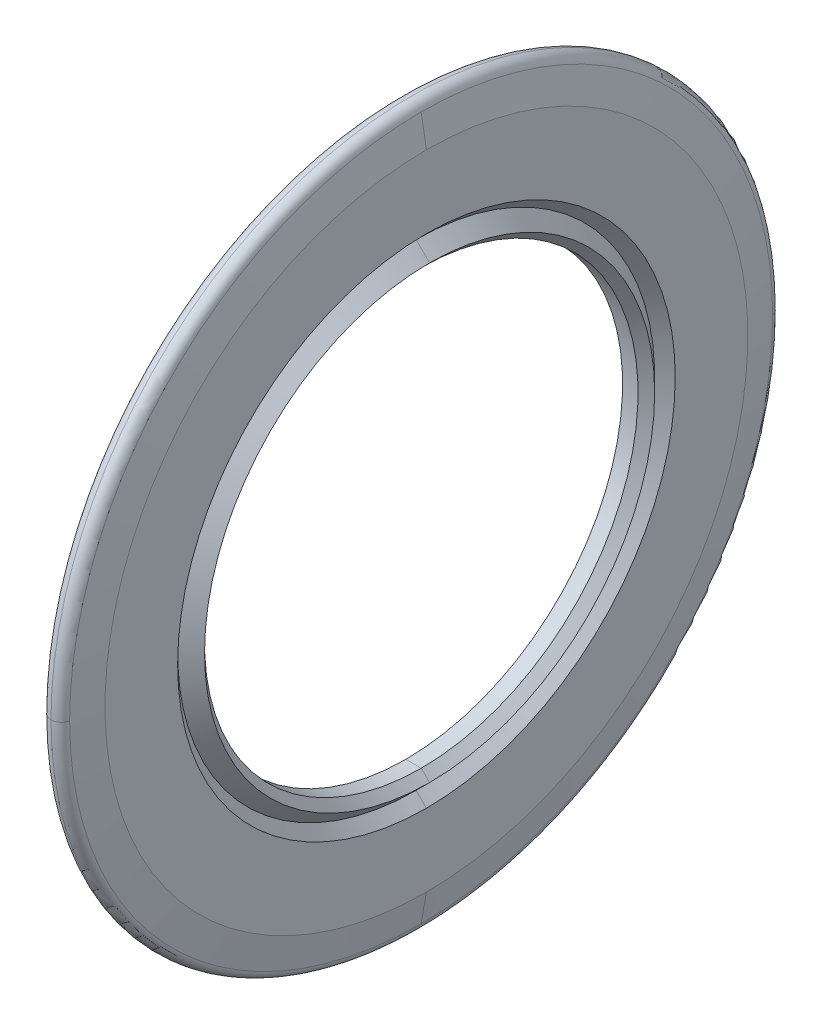
ISO-10303-21;
HEADER;
FILE_DESCRIPTION(('STEP AP214'),'2;1');
FILE_NAME('part.step','',(''),(''),'','','');
FILE_SCHEMA(('AUTOMOTIVE_DESIGN { 1 0 10303 214 1 1 1 1 }'));
ENDSEC;
DATA;
#1=APPLICATION_CONTEXT('core data for automotive mechanical design processes');
#2=APPLICATION_PROTOCOL_DEFINITION('international standard','automotive_design',2000,#1);
#3=PRODUCT_CONTEXT('',#1,'mechanical');
#4=PRODUCT('Part','Part','',(#3));
#5=PRODUCT_RELATED_PRODUCT_CATEGORY('part','',(#4));
#6=PRODUCT_DEFINITION_FORMATION('','',#4);
#7=PRODUCT_DEFINITION_CONTEXT('part definition',#1,'design');
#8=PRODUCT_DEFINITION('design','',#6,#7);
#9=PRODUCT_DEFINITION_SHAPE('','',#8);
#10=(LENGTH_UNIT() NAMED_UNIT(*) SI_UNIT(.MILLI.,.METRE.));
#11=(NAMED_UNIT(*) PLANE_ANGLE_UNIT() SI_UNIT($,.RADIAN.));
#12=(NAMED_UNIT(*) SI_UNIT($,.STERADIAN.) SOLID_ANGLE_UNIT());
#13=UNCERTAINTY_MEASURE_WITH_UNIT(LENGTH_MEASURE(1.E-05),#10,'distance_accuracy_value','');
#14=(GEOMETRIC_REPRESENTATION_CONTEXT(3) GLOBAL_UNCERTAINTY_ASSIGNED_CONTEXT((#13)) GLOBAL_UNIT_ASSIGNED_CONTEXT((#10,
#11,#12)) REPRESENTATION_CONTEXT('',''));
#15=CARTESIAN_POINT('',(0.,0.,0.));
#16=DIRECTION('',(0.,0.,1.));
#17=DIRECTION('',(1.,0.,0.));
#18=AXIS2_PLACEMENT_3D('',#15,#16,#17);
#19=CARTESIAN_POINT('',(0.14,9.2215,0.));
#20=DIRECTION('',(-1.,0.,0.));
#21=DIRECTION('',(0.,0.,1.));
#22=AXIS2_PLACEMENT_3D('',#19,#20,#21);
#23=PLANE('',#22);
#24=CARTESIAN_POINT('',(0.14,0.,0.));
#25=DIRECTION('',(1.,0.,0.));
#26=DIRECTION('',(0.,1.,0.));
#27=AXIS2_PLACEMENT_3D('',#24,#25,#26);
#28=CIRCLE('',#27,8.9335);
#29=CARTESIAN_POINT('',(0.14,8.9335,0.));
#30=VERTEX_POINT('',#29);
#31=CARTESIAN_POINT('',(0.14,-8.9335,0.));
#32=VERTEX_POINT('',#31);
#33=EDGE_CURVE('E11',#30,#32,#28,.T.);
#34=ORIENTED_EDGE('',*,*,#33,.T.);
#35=CARTESIAN_POINT('',(0.14,0.,0.));
#36=DIRECTION('',(1.,0.,0.));
#37=DIRECTION('',(0.,1.,0.));
#38=AXIS2_PLACEMENT_3D('',#35,#36,#37);
#39=CIRCLE('',#38,8.9335);
#40=EDGE_CURVE('E192',#32,#30,#39,.T.);
#41=ORIENTED_EDGE('',*,*,#40,.T.);
#42=EDGE_LOOP('',(#34,#41));
#43=FACE_BOUND('',#42,.T.);
#44=CARTESIAN_POINT('',(0.14,0.,0.));
#45=DIRECTION('',(1.,0.,0.));
#46=DIRECTION('',(0.,1.,0.));
#47=AXIS2_PLACEMENT_3D('',#44,#45,#46);
#48=CIRCLE('',#47,9.5095);
#49=CARTESIAN_POINT('',(0.14,0.,-9.5095));
#50=VERTEX_POINT('',#49);
#51=CARTESIAN_POINT('',(0.14,0.,9.5095));
#52=VERTEX_POINT('',#51);
#53=EDGE_CURVE('E148',#50,#52,#48,.T.);
#54=ORIENTED_EDGE('',*,*,#53,.F.);
#55=CARTESIAN_POINT('',(0.14,0.,0.));
#56=DIRECTION('',(1.,0.,0.));
#57=DIRECTION('',(0.,1.,0.));
#58=AXIS2_PLACEMENT_3D('',#55,#56,#57);
#59=CIRCLE('',#58,9.5095);
#60=EDGE_CURVE('E157',#52,#50,#59,.T.);
#61=ORIENTED_EDGE('',*,*,#60,.F.);
#62=EDGE_LOOP('',(#54,#61));
#63=FACE_BOUND('',#62,.T.);
#64=ADVANCED_FACE('F16',(#43,#63),#23,.T.);
#65=CARTESIAN_POINT('',(0.21,0.,0.));
#66=DIRECTION('',(-1.,0.,0.));
#67=DIRECTION('',(0.,1.,0.));
#68=AXIS2_PLACEMENT_3D('',#65,#66,#67);
#69=CONICAL_SURFACE('',#68,8.8635,0.785398163397444);
#70=DIRECTION('',(0.70710678118655,-0.707106781186545,0.));
#71=VECTOR('',#70,1.);
#72=CARTESIAN_POINT('',(0.21,8.8635,0.));
#73=LINE('',#72,#71);
#74=CARTESIAN_POINT('',(0.28,8.7935,0.));
#75=VERTEX_POINT('',#74);
#76=EDGE_CURVE('E169',#30,#75,#73,.T.);
#77=ORIENTED_EDGE('',*,*,#76,.T.);
#78=CARTESIAN_POINT('',(0.28,0.,0.));
#79=DIRECTION('',(1.,0.,0.));
#80=DIRECTION('',(0.,1.,0.));
#81=AXIS2_PLACEMENT_3D('',#78,#79,#80);
#82=CIRCLE('',#81,8.7935);
#83=CARTESIAN_POINT('',(0.28,-8.7935,0.));
#84=VERTEX_POINT('',#83);
#85=EDGE_CURVE('E23',#75,#84,#82,.T.);
#86=ORIENTED_EDGE('',*,*,#85,.T.);
#87=DIRECTION('',(-0.70710678118655,-0.707106781186545,0.));
#88=VECTOR('',#87,1.);
#89=CARTESIAN_POINT('',(0.21,-8.8635,0.));
#90=LINE('',#89,#88);
#91=EDGE_CURVE('E195',#84,#32,#90,.T.);
#92=ORIENTED_EDGE('',*,*,#91,.T.);
#93=ORIENTED_EDGE('',*,*,#33,.F.);
#94=EDGE_LOOP('',(#77,#86,#92,#93));
#95=FACE_BOUND('',#94,.T.);
#96=ADVANCED_FACE('F274',(#95),#69,.F.);
#97=CARTESIAN_POINT('',(0.28,7.8535,0.));
#98=DIRECTION('',(-1.,0.,0.));
#99=DIRECTION('',(0.,0.,1.));
#100=AXIS2_PLACEMENT_3D('',#97,#98,#99);
#101=PLANE('',#100);
#102=CARTESIAN_POINT('',(0.28,0.,0.));
#103=DIRECTION('',(1.,0.,0.));
#104=DIRECTION('',(0.,1.,0.));
#105=AXIS2_PLACEMENT_3D('',#102,#103,#104);
#106=CIRCLE('',#105,6.9135);
#107=CARTESIAN_POINT('',(0.28,6.9135,0.));
#108=VERTEX_POINT('',#107);
#109=CARTESIAN_POINT('',(0.28,-6.9135,0.));
#110=VERTEX_POINT('',#109);
#111=EDGE_CURVE('E167',#108,#110,#106,.T.);
#112=ORIENTED_EDGE('',*,*,#111,.T.);
#113=CARTESIAN_POINT('',(0.28,0.,0.));
#114=DIRECTION('',(1.,0.,0.));
#115=DIRECTION('',(0.,1.,0.));
#116=AXIS2_PLACEMENT_3D('',#113,#114,#115);
#117=CIRCLE('',#116,6.9135);
#118=EDGE_CURVE('E208',#110,#108,#117,.T.);
#119=ORIENTED_EDGE('',*,*,#118,.T.);
#120=EDGE_LOOP('',(#112,#119));
#121=FACE_BOUND('',#120,.T.);
#122=ORIENTED_EDGE('',*,*,#85,.F.);
#123=CARTESIAN_POINT('',(0.28,0.,0.));
#124=DIRECTION('',(1.,0.,0.));
#125=DIRECTION('',(0.,1.,0.));
#126=AXIS2_PLACEMENT_3D('',#123,#124,#125);
#127=CIRCLE('',#126,8.7935);
#128=EDGE_CURVE('E202',#84,#75,#127,.T.);
#129=ORIENTED_EDGE('',*,*,#128,.F.);
#130=EDGE_LOOP('',(#122,#129));
#131=FACE_BOUND('',#130,.T.);
#132=ADVANCED_FACE('F279',(#121,#131),#101,.T.);
#133=CARTESIAN_POINT('',(0.21,0.,0.));
#134=DIRECTION('',(1.,0.,0.));
#135=DIRECTION('',(0.,1.,0.));
#136=AXIS2_PLACEMENT_3D('',#133,#134,#135);
#137=CONICAL_SURFACE('',#136,6.8435,0.785398163397448);
#138=DIRECTION('',(0.707106781186548,0.707106781186547,0.));
#139=VECTOR('',#138,1.);
#140=CARTESIAN_POINT('',(0.21,6.8435,0.));
#141=LINE('',#140,#139);
#142=CARTESIAN_POINT('',(0.14,6.7735,0.));
#143=VERTEX_POINT('',#142);
#144=EDGE_CURVE('E205',#143,#108,#141,.T.);
#145=ORIENTED_EDGE('',*,*,#144,.T.);
#146=ORIENTED_EDGE('',*,*,#118,.F.);
#147=DIRECTION('',(-0.707106781186548,0.707106781186547,0.));
#148=VECTOR('',#147,1.);
#149=CARTESIAN_POINT('',(0.21,-6.8435,0.));
#150=LINE('',#149,#148);
#151=CARTESIAN_POINT('',(0.14,-6.7735,0.));
#152=VERTEX_POINT('',#151);
#153=EDGE_CURVE('E164',#110,#152,#150,.T.);
#154=ORIENTED_EDGE('',*,*,#153,.T.);
#155=CARTESIAN_POINT('',(0.14,0.,0.));
#156=DIRECTION('',(1.,0.,0.));
#157=DIRECTION('',(0.,1.,0.));
#158=AXIS2_PLACEMENT_3D('',#155,#156,#157);
#159=CIRCLE('',#158,6.7735);
#160=EDGE_CURVE('E206',#152,#143,#159,.T.);
#161=ORIENTED_EDGE('',*,*,#160,.T.);
#162=EDGE_LOOP('',(#145,#146,#154,#161));
#163=FACE_BOUND('',#162,.T.);
#164=ADVANCED_FACE('F292',(#163),#137,.T.);
#165=CARTESIAN_POINT('',(0.14,6.6295,0.));
#166=DIRECTION('',(-1.,0.,0.));
#167=DIRECTION('',(0.,0.,1.));
#168=AXIS2_PLACEMENT_3D('',#165,#166,#167);
#169=PLANE('',#168);
#170=CARTESIAN_POINT('',(0.14,0.,0.));
#171=DIRECTION('',(1.,0.,0.));
#172=DIRECTION('',(0.,1.,0.));
#173=AXIS2_PLACEMENT_3D('',#170,#171,#172);
#174=CIRCLE('',#173,6.4855);
#175=CARTESIAN_POINT('',(0.14,6.4855,0.));
#176=VERTEX_POINT('',#175);
#177=CARTESIAN_POINT('',(0.14,-6.4855,0.));
#178=VERTEX_POINT('',#177);
#179=EDGE_CURVE('E209',#176,#178,#174,.T.);
#180=ORIENTED_EDGE('',*,*,#179,.T.);
#181=CARTESIAN_POINT('',(0.14,0.,0.));
#182=DIRECTION('',(1.,0.,0.));
#183=DIRECTION('',(0.,1.,0.));
#184=AXIS2_PLACEMENT_3D('',#181,#182,#183);
#185=CIRCLE('',#184,6.4855);
#186=EDGE_CURVE('E196',#178,#176,#185,.T.);
#187=ORIENTED_EDGE('',*,*,#186,.T.);
#188=EDGE_LOOP('',(#180,#187));
#189=FACE_BOUND('',#188,.T.);
#190=CARTESIAN_POINT('',(0.14,0.,0.));
#191=DIRECTION('',(1.,0.,0.));
#192=DIRECTION('',(0.,1.,0.));
#193=AXIS2_PLACEMENT_3D('',#190,#191,#192);
#194=CIRCLE('',#193,6.7735);
#195=EDGE_CURVE('E168',#143,#152,#194,.T.);
#196=ORIENTED_EDGE('',*,*,#195,.F.);
#197=ORIENTED_EDGE('',*,*,#160,.F.);
#198=EDGE_LOOP('',(#196,#197));
#199=FACE_BOUND('',#198,.T.);
#200=ADVANCED_FACE('F298',(#189,#199),#169,.T.);
#201=CARTESIAN_POINT('',(0.32285,0.,0.));
#202=DIRECTION('',(-1.,0.,0.));
#203=DIRECTION('',(0.,1.,0.));
#204=AXIS2_PLACEMENT_3D('',#201,#202,#203);
#205=CONICAL_SURFACE('',#204,6.30265,0.785398163397448);
#206=DIRECTION('',(0.707106781186548,-0.707106781186547,0.));
#207=VECTOR('',#206,1.);
#208=CARTESIAN_POINT('',(0.32285,6.30265,0.));
#209=LINE('',#208,#207);
#210=CARTESIAN_POINT('',(0.5057,6.1198,0.));
#211=VERTEX_POINT('',#210);
#212=EDGE_CURVE('E175',#176,#211,#209,.T.);
#213=ORIENTED_EDGE('',*,*,#212,.T.);
#214=CARTESIAN_POINT('',(0.5057,0.,0.));
#215=DIRECTION('',(1.,0.,0.));
#216=DIRECTION('',(0.,1.,0.));
#217=AXIS2_PLACEMENT_3D('',#214,#215,#216);
#218=CIRCLE('',#217,6.1198);
#219=CARTESIAN_POINT('',(0.5057,-6.1198,0.));
#220=VERTEX_POINT('',#219);
#221=EDGE_CURVE('E230',#211,#220,#218,.T.);
#222=ORIENTED_EDGE('',*,*,#221,.T.);
#223=DIRECTION('',(-0.707106781186548,-0.707106781186547,0.));
#224=VECTOR('',#223,1.);
#225=CARTESIAN_POINT('',(0.32285,-6.30265,0.));
#226=LINE('',#225,#224);
#227=EDGE_CURVE('E199',#220,#178,#226,.T.);
#228=ORIENTED_EDGE('',*,*,#227,.T.);
#229=ORIENTED_EDGE('',*,*,#179,.F.);
#230=EDGE_LOOP('',(#213,#222,#228,#229));
#231=FACE_BOUND('',#230,.T.);
#232=ADVANCED_FACE('F302',(#231),#205,.F.);
#233=CARTESIAN_POINT('',(0.39285,0.,0.));
#234=DIRECTION('',(1.,0.,0.));
#235=DIRECTION('',(0.,1.,0.));
#236=AXIS2_PLACEMENT_3D('',#233,#234,#235);
#237=CONICAL_SURFACE('',#236,6.00695,0.785398163397451);
#238=DIRECTION('',(0.707106781186545,0.70710678118655,0.));
#239=VECTOR('',#238,1.);
#240=CARTESIAN_POINT('',(0.39285,6.00695,0.));
#241=LINE('',#240,#239);
#242=CARTESIAN_POINT('',(0.28,5.8941,0.));
#243=VERTEX_POINT('',#242);
#244=EDGE_CURVE('E221',#243,#211,#241,.T.);
#245=ORIENTED_EDGE('',*,*,#244,.T.);
#246=CARTESIAN_POINT('',(0.5057,0.,0.));
#247=DIRECTION('',(1.,0.,0.));
#248=DIRECTION('',(0.,1.,0.));
#249=AXIS2_PLACEMENT_3D('',#246,#247,#248);
#250=CIRCLE('',#249,6.1198);
#251=EDGE_CURVE('E218',#220,#211,#250,.T.);
#252=ORIENTED_EDGE('',*,*,#251,.F.);
#253=DIRECTION('',(-0.707106781186545,0.70710678118655,0.));
#254=VECTOR('',#253,1.);
#255=CARTESIAN_POINT('',(0.39285,-6.00695,0.));
#256=LINE('',#255,#254);
#257=CARTESIAN_POINT('',(0.28,-5.8941,0.));
#258=VERTEX_POINT('',#257);
#259=EDGE_CURVE('E227',#220,#258,#256,.T.);
#260=ORIENTED_EDGE('',*,*,#259,.T.);
#261=CARTESIAN_POINT('',(0.28,0.,0.));
#262=DIRECTION('',(1.,0.,0.));
#263=DIRECTION('',(0.,1.,0.));
#264=AXIS2_PLACEMENT_3D('',#261,#262,#263);
#265=CIRCLE('',#264,5.8941);
#266=EDGE_CURVE('E237',#258,#243,#265,.T.);
#267=ORIENTED_EDGE('',*,*,#266,.T.);
#268=EDGE_LOOP('',(#245,#252,#260,#267));
#269=FACE_BOUND('',#268,.T.);
#270=ADVANCED_FACE('F306',(#269),#237,.T.);
#271=CARTESIAN_POINT('',(0.49,0.,0.));
#272=DIRECTION('',(1.,0.,0.));
#273=DIRECTION('',(0.,1.,0.));
#274=AXIS2_PLACEMENT_3D('',#271,#272,#273);
#275=CYLINDRICAL_SURFACE('',#274,5.8941);
#276=DIRECTION('',(1.,0.,0.));
#277=VECTOR('',#276,1.);
#278=CARTESIAN_POINT('',(0.49,5.8941,0.));
#279=LINE('',#278,#277);
#280=CARTESIAN_POINT('',(0.7,5.8941,0.));
#281=VERTEX_POINT('',#280);
#282=EDGE_CURVE('E234',#243,#281,#279,.T.);
#283=ORIENTED_EDGE('',*,*,#282,.T.);
#284=CARTESIAN_POINT('',(0.7,0.,0.));
#285=DIRECTION('',(1.,0.,0.));
#286=DIRECTION('',(0.,1.,0.));
#287=AXIS2_PLACEMENT_3D('',#284,#285,#286);
#288=CIRCLE('',#287,5.8941);
#289=CARTESIAN_POINT('',(0.7,-5.8941,0.));
#290=VERTEX_POINT('',#289);
#291=EDGE_CURVE('E232',#281,#290,#288,.T.);
#292=ORIENTED_EDGE('',*,*,#291,.T.);
#293=DIRECTION('',(-1.,0.,0.));
#294=VECTOR('',#293,1.);
#295=CARTESIAN_POINT('',(0.49,-5.8941,0.));
#296=LINE('',#295,#294);
#297=EDGE_CURVE('E189',#290,#258,#296,.T.);
#298=ORIENTED_EDGE('',*,*,#297,.T.);
#299=CARTESIAN_POINT('',(0.28,0.,0.));
#300=DIRECTION('',(1.,0.,0.));
#301=DIRECTION('',(0.,1.,0.));
#302=AXIS2_PLACEMENT_3D('',#299,#300,#301);
#303=CIRCLE('',#302,5.8941);
#304=EDGE_CURVE('E224',#243,#258,#303,.T.);
#305=ORIENTED_EDGE('',*,*,#304,.F.);
#306=EDGE_LOOP('',(#283,#292,#298,#305));
#307=FACE_BOUND('',#306,.T.);
#308=ADVANCED_FACE('F310',(#307),#275,.F.);
#309=CARTESIAN_POINT('',(0.81285,0.,0.));
#310=DIRECTION('',(1.,0.,0.));
#311=DIRECTION('',(0.,1.,0.));
#312=AXIS2_PLACEMENT_3D('',#309,#310,#311);
#313=CONICAL_SURFACE('',#312,6.00695,0.785398163397447);
#314=DIRECTION('',(0.707106781186549,0.707106781186546,0.));
#315=VECTOR('',#314,1.);
#316=CARTESIAN_POINT('',(0.81285,6.00695,0.));
#317=LINE('',#316,#315);
#318=CARTESIAN_POINT('',(0.9257,6.1198,0.));
#319=VERTEX_POINT('',#318);
#320=EDGE_CURVE('E188',#281,#319,#317,.T.);
#321=ORIENTED_EDGE('',*,*,#320,.T.);
#322=CARTESIAN_POINT('',(0.9257,0.,0.));
#323=DIRECTION('',(1.,0.,0.));
#324=DIRECTION('',(0.,1.,0.));
#325=AXIS2_PLACEMENT_3D('',#322,#323,#324);
#326=CIRCLE('',#325,6.1198);
#327=CARTESIAN_POINT('',(0.9257,-6.1198,0.));
#328=VERTEX_POINT('',#327);
#329=EDGE_CURVE('E181',#319,#328,#326,.T.);
#330=ORIENTED_EDGE('',*,*,#329,.T.);
#331=DIRECTION('',(-0.707106781186549,0.707106781186546,0.));
#332=VECTOR('',#331,1.);
#333=CARTESIAN_POINT('',(0.81285,-6.00695,0.));
#334=LINE('',#333,#332);
#335=EDGE_CURVE('E243',#328,#290,#334,.T.);
#336=ORIENTED_EDGE('',*,*,#335,.T.);
#337=ORIENTED_EDGE('',*,*,#291,.F.);
#338=EDGE_LOOP('',(#321,#330,#336,#337));
#339=FACE_BOUND('',#338,.T.);
#340=ADVANCED_FACE('F314',(#339),#313,.F.);
#341=CARTESIAN_POINT('',(0.74285,0.,0.));
#342=DIRECTION('',(-1.,0.,0.));
#343=DIRECTION('',(0.,1.,0.));
#344=AXIS2_PLACEMENT_3D('',#341,#342,#343);
#345=CONICAL_SURFACE('',#344,6.30265,0.785398163397449);
#346=DIRECTION('',(0.707106781186547,-0.707106781186548,0.));
#347=VECTOR('',#346,1.);
#348=CARTESIAN_POINT('',(0.74285,6.30265,0.));
#349=LINE('',#348,#347);
#350=CARTESIAN_POINT('',(0.56,6.4855,0.));
#351=VERTEX_POINT('',#350);
#352=EDGE_CURVE('E249',#351,#319,#349,.T.);
#353=ORIENTED_EDGE('',*,*,#352,.T.);
#354=CARTESIAN_POINT('',(0.9257,0.,0.));
#355=DIRECTION('',(1.,0.,0.));
#356=DIRECTION('',(0.,1.,0.));
#357=AXIS2_PLACEMENT_3D('',#354,#355,#356);
#358=CIRCLE('',#357,6.1198);
#359=EDGE_CURVE('E246',#328,#319,#358,.T.);
#360=ORIENTED_EDGE('',*,*,#359,.F.);
#361=DIRECTION('',(-0.707106781186547,-0.707106781186548,0.));
#362=VECTOR('',#361,1.);
#363=CARTESIAN_POINT('',(0.74285,-6.30265,0.));
#364=LINE('',#363,#362);
#365=CARTESIAN_POINT('',(0.56,-6.4855,0.));
#366=VERTEX_POINT('',#365);
#367=EDGE_CURVE('E163',#328,#366,#364,.T.);
#368=ORIENTED_EDGE('',*,*,#367,.T.);
#369=CARTESIAN_POINT('',(0.56,0.,0.));
#370=DIRECTION('',(1.,0.,0.));
#371=DIRECTION('',(0.,1.,0.));
#372=AXIS2_PLACEMENT_3D('',#369,#370,#371);
#373=CIRCLE('',#372,6.4855);
#374=EDGE_CURVE('E179',#366,#351,#373,.T.);
#375=ORIENTED_EDGE('',*,*,#374,.T.);
#376=EDGE_LOOP('',(#353,#360,#368,#375));
#377=FACE_BOUND('',#376,.T.);
#378=ADVANCED_FACE('F318',(#377),#345,.T.);
#379=CARTESIAN_POINT('',(0.7,0.,0.));
#380=DIRECTION('',(1.,0.,0.));
#381=DIRECTION('',(0.,1.,0.));
#382=AXIS2_PLACEMENT_3D('',#379,#380,#381);
#383=CONICAL_SURFACE('',#382,6.6255,0.785398163397451);
#384=DIRECTION('',(0.707106781186546,0.707106781186549,0.));
#385=VECTOR('',#384,1.);
#386=CARTESIAN_POINT('',(0.7,6.6255,0.));
#387=LINE('',#386,#385);
#388=CARTESIAN_POINT('',(0.84,6.7655,0.));
#389=VERTEX_POINT('',#388);
#390=EDGE_CURVE('E183',#351,#389,#387,.T.);
#391=ORIENTED_EDGE('',*,*,#390,.T.);
#392=CARTESIAN_POINT('',(0.84,0.,0.));
#393=DIRECTION('',(1.,0.,0.));
#394=DIRECTION('',(0.,1.,0.));
#395=AXIS2_PLACEMENT_3D('',#392,#393,#394);
#396=CIRCLE('',#395,6.7655);
#397=CARTESIAN_POINT('',(0.84,-6.7655,0.));
#398=VERTEX_POINT('',#397);
#399=EDGE_CURVE('E172',#389,#398,#396,.T.);
#400=ORIENTED_EDGE('',*,*,#399,.T.);
#401=DIRECTION('',(-0.707106781186546,0.707106781186549,0.));
#402=VECTOR('',#401,1.);
#403=CARTESIAN_POINT('',(0.7,-6.6255,0.));
#404=LINE('',#403,#402);
#405=EDGE_CURVE('E176',#398,#366,#404,.T.);
#406=ORIENTED_EDGE('',*,*,#405,.T.);
#407=CARTESIAN_POINT('',(0.56,0.,0.));
#408=DIRECTION('',(1.,0.,0.));
#409=DIRECTION('',(0.,1.,0.));
#410=AXIS2_PLACEMENT_3D('',#407,#408,#409);
#411=CIRCLE('',#410,6.4855);
#412=EDGE_CURVE('E252',#351,#366,#411,.T.);
#413=ORIENTED_EDGE('',*,*,#412,.F.);
#414=EDGE_LOOP('',(#391,#400,#406,#413));
#415=FACE_BOUND('',#414,.T.);
#416=ADVANCED_FACE('F322',(#415),#383,.F.);
#417=CARTESIAN_POINT('',(0.84,7.75275868552039,0.));
#418=DIRECTION('',(1.,0.,0.));
#419=DIRECTION('',(0.,1.,0.));
#420=AXIS2_PLACEMENT_3D('',#417,#418,#419);
#421=PLANE('',#420);
#422=ORIENTED_EDGE('',*,*,#399,.F.);
#423=CARTESIAN_POINT('',(0.84,0.,0.));
#424=DIRECTION('',(1.,0.,0.));
#425=DIRECTION('',(0.,1.,0.));
#426=AXIS2_PLACEMENT_3D('',#423,#424,#425);
#427=CIRCLE('',#426,6.7655);
#428=EDGE_CURVE('E178',#398,#389,#427,.T.);
#429=ORIENTED_EDGE('',*,*,#428,.F.);
#430=EDGE_LOOP('',(#422,#429));
#431=FACE_BOUND('',#430,.T.);
#432=CARTESIAN_POINT('',(0.84,0.,0.));
#433=DIRECTION('',(1.,0.,0.));
#434=DIRECTION('',(0.,1.,0.));
#435=AXIS2_PLACEMENT_3D('',#432,#433,#434);
#436=CIRCLE('',#435,8.74001737104078);
#437=CARTESIAN_POINT('',(0.84,8.74001737104078,0.));
#438=VERTEX_POINT('',#437);
#439=CARTESIAN_POINT('',(0.84,-8.74001737104078,0.));
#440=VERTEX_POINT('',#439);
#441=EDGE_CURVE('E137',#438,#440,#436,.T.);
#442=ORIENTED_EDGE('',*,*,#441,.T.);
#443=CARTESIAN_POINT('',(0.84,0.,0.));
#444=DIRECTION('',(1.,0.,0.));
#445=DIRECTION('',(0.,1.,0.));
#446=AXIS2_PLACEMENT_3D('',#443,#444,#445);
#447=CIRCLE('',#446,8.74001737104078);
#448=EDGE_CURVE('E36',#440,#438,#447,.T.);
#449=ORIENTED_EDGE('',*,*,#448,.T.);
#450=EDGE_LOOP('',(#442,#449));
#451=FACE_BOUND('',#450,.T.);
#452=ADVANCED_FACE('F327',(#431,#451),#421,.T.);
#453=CARTESIAN_POINT('',(0.767873085421708,0.,0.));
#454=DIRECTION('',(-1.,0.,0.));
#455=DIRECTION('',(0.,1.,0.));
#456=AXIS2_PLACEMENT_3D('',#453,#454,#455);
#457=CONICAL_SURFACE('',#456,9.14906943039376,1.39626340159546);
#458=DIRECTION('',(0.173648177666931,-0.984807753012208,0.));
#459=VECTOR('',#458,1.);
#460=CARTESIAN_POINT('',(0.767873085421708,9.14906943039376,0.));
#461=LINE('',#460,#459);
#462=CARTESIAN_POINT('',(0.695746170843418,9.55812148974674,0.));
#463=VERTEX_POINT('',#462);
#464=EDGE_CURVE('E260',#463,#438,#461,.T.);
#465=ORIENTED_EDGE('',*,*,#464,.T.);
#466=ORIENTED_EDGE('',*,*,#448,.F.);
#467=DIRECTION('',(-0.173648177666931,-0.984807753012208,0.));
#468=VECTOR('',#467,1.);
#469=CARTESIAN_POINT('',(0.767873085421708,-9.14906943039376,0.));
#470=LINE('',#469,#468);
#471=CARTESIAN_POINT('',(0.695746170843418,-9.55812148974674,0.));
#472=VERTEX_POINT('',#471);
#473=EDGE_CURVE('E265',#440,#472,#470,.T.);
#474=ORIENTED_EDGE('',*,*,#473,.T.);
#475=CARTESIAN_POINT('',(0.695746170843418,0.,0.));
#476=DIRECTION('',(1.,0.,0.));
#477=DIRECTION('',(0.,1.,0.));
#478=AXIS2_PLACEMENT_3D('',#475,#476,#477);
#479=CIRCLE('',#478,9.55812148974674);
#480=CARTESIAN_POINT('',(0.695746170843418,0.,-9.55812148974674));
#481=VERTEX_POINT('',#480);
#482=EDGE_CURVE('E30',#472,#481,#479,.T.);
#483=ORIENTED_EDGE('',*,*,#482,.T.);
#484=CARTESIAN_POINT('',(0.695746170843418,0.,0.));
#485=DIRECTION('',(1.,0.,0.));
#486=DIRECTION('',(0.,1.,0.));
#487=AXIS2_PLACEMENT_3D('',#484,#485,#486);
#488=CIRCLE('',#487,9.55812148974674);
#489=EDGE_CURVE('E136',#481,#463,#488,.T.);
#490=ORIENTED_EDGE('',*,*,#489,.T.);
#491=EDGE_LOOP('',(#465,#466,#474,#483,#490));
#492=FACE_BOUND('',#491,.T.);
#493=ADVANCED_FACE('F324',(#492),#457,.T.);
#494=CARTESIAN_POINT('',(0.42,0.,0.));
#495=DIRECTION('',(1.,0.,0.));
#496=DIRECTION('',(0.,0.,-1.));
#497=AXIS2_PLACEMENT_3D('',#494,#495,#496);
#498=TOROIDAL_SURFACE('',#497,9.5095,0.28);
#499=CARTESIAN_POINT('',(0.42,0.,0.));
#500=DIRECTION('',(1.,0.,0.));
#501=DIRECTION('',(0.,0.,-1.));
#502=AXIS2_PLACEMENT_3D('',#499,#500,#501);
#503=CIRCLE('',#502,9.7895);
#504=CARTESIAN_POINT('',(0.42,0.,9.7895));
#505=VERTEX_POINT('',#504);
#506=CARTESIAN_POINT('',(0.42,0.,-9.7895));
#507=VERTEX_POINT('',#506);
#508=EDGE_CURVE('E130',#505,#507,#503,.T.);
#509=ORIENTED_EDGE('',*,*,#508,.T.);
#510=CARTESIAN_POINT('',(0.42,0.,-9.5095));
#511=DIRECTION('',(0.,-1.,0.));
#512=DIRECTION('',(0.,0.,-1.));
#513=AXIS2_PLACEMENT_3D('',#510,#511,#512);
#514=CIRCLE('',#513,0.28);
#515=EDGE_CURVE('E144',#507,#481,#514,.T.);
#516=ORIENTED_EDGE('',*,*,#515,.T.);
#517=ORIENTED_EDGE('',*,*,#482,.F.);
#518=CARTESIAN_POINT('',(0.695746170843418,0.,0.));
#519=DIRECTION('',(1.,0.,0.));
#520=DIRECTION('',(0.,1.,0.));
#521=AXIS2_PLACEMENT_3D('',#518,#519,#520);
#522=CIRCLE('',#521,9.55812148974674);
#523=CARTESIAN_POINT('',(0.695746170843418,0.,9.55812148974674));
#524=VERTEX_POINT('',#523);
#525=EDGE_CURVE('E132',#524,#472,#522,.T.);
#526=ORIENTED_EDGE('',*,*,#525,.F.);
#527=CARTESIAN_POINT('',(0.42,0.,9.5095));
#528=DIRECTION('',(0.,-1.,0.));
#529=DIRECTION('',(0.,0.,1.));
#530=AXIS2_PLACEMENT_3D('',#527,#528,#529);
#531=CIRCLE('',#530,0.28);
#532=EDGE_CURVE('E126',#524,#505,#531,.T.);
#533=ORIENTED_EDGE('',*,*,#532,.T.);
#534=EDGE_LOOP('',(#509,#516,#517,#526,#533));
#535=FACE_BOUND('',#534,.T.);
#536=ADVANCED_FACE('F128',(#535),#498,.T.);
#537=CARTESIAN_POINT('',(0.42,0.,0.));
#538=DIRECTION('',(1.,0.,0.));
#539=DIRECTION('',(0.,0.,-1.));
#540=AXIS2_PLACEMENT_3D('',#537,#538,#539);
#541=TOROIDAL_SURFACE('',#540,9.5095,0.28);
#542=CARTESIAN_POINT('',(0.42,0.,0.));
#543=DIRECTION('',(1.,0.,0.));
#544=DIRECTION('',(0.,0.,-1.));
#545=AXIS2_PLACEMENT_3D('',#542,#543,#544);
#546=CIRCLE('',#545,9.7895);
#547=EDGE_CURVE('E140',#507,#505,#546,.T.);
#548=ORIENTED_EDGE('',*,*,#547,.T.);
#549=ORIENTED_EDGE('',*,*,#532,.F.);
#550=CARTESIAN_POINT('',(0.695746170843418,0.,0.));
#551=DIRECTION('',(1.,0.,0.));
#552=DIRECTION('',(0.,1.,0.));
#553=AXIS2_PLACEMENT_3D('',#550,#551,#552);
#554=CIRCLE('',#553,9.55812148974674);
#555=EDGE_CURVE('E262',#463,#524,#554,.T.);
#556=ORIENTED_EDGE('',*,*,#555,.F.);
#557=ORIENTED_EDGE('',*,*,#489,.F.);
#558=ORIENTED_EDGE('',*,*,#515,.F.);
#559=EDGE_LOOP('',(#548,#549,#556,#557,#558));
#560=FACE_BOUND('',#559,.T.);
#561=ADVANCED_FACE('F142',(#560),#541,.T.);
#562=CARTESIAN_POINT('',(0.767873085421708,0.,0.));
#563=DIRECTION('',(-1.,0.,0.));
#564=DIRECTION('',(0.,1.,0.));
#565=AXIS2_PLACEMENT_3D('',#562,#563,#564);
#566=CONICAL_SURFACE('',#565,9.14906943039376,1.39626340159546);
#567=ORIENTED_EDGE('',*,*,#464,.F.);
#568=ORIENTED_EDGE('',*,*,#555,.T.);
#569=ORIENTED_EDGE('',*,*,#525,.T.);
#570=ORIENTED_EDGE('',*,*,#473,.F.);
#571=ORIENTED_EDGE('',*,*,#441,.F.);
#572=EDGE_LOOP('',(#567,#568,#569,#570,#571));
#573=FACE_BOUND('',#572,.T.);
#574=ADVANCED_FACE('F335',(#573),#566,.T.);
#575=CARTESIAN_POINT('',(0.7,0.,0.));
#576=DIRECTION('',(1.,0.,0.));
#577=DIRECTION('',(0.,1.,0.));
#578=AXIS2_PLACEMENT_3D('',#575,#576,#577);
#579=CONICAL_SURFACE('',#578,6.6255,0.785398163397451);
#580=ORIENTED_EDGE('',*,*,#390,.F.);
#581=ORIENTED_EDGE('',*,*,#374,.F.);
#582=ORIENTED_EDGE('',*,*,#405,.F.);
#583=ORIENTED_EDGE('',*,*,#428,.T.);
#584=EDGE_LOOP('',(#580,#581,#582,#583));
#585=FACE_BOUND('',#584,.T.);
#586=ADVANCED_FACE('F350',(#585),#579,.F.);
#587=CARTESIAN_POINT('',(0.74285,0.,0.));
#588=DIRECTION('',(-1.,0.,0.));
#589=DIRECTION('',(0.,1.,0.));
#590=AXIS2_PLACEMENT_3D('',#587,#588,#589);
#591=CONICAL_SURFACE('',#590,6.30265,0.785398163397449);
#592=ORIENTED_EDGE('',*,*,#352,.F.);
#593=ORIENTED_EDGE('',*,*,#412,.T.);
#594=ORIENTED_EDGE('',*,*,#367,.F.);
#595=ORIENTED_EDGE('',*,*,#329,.F.);
#596=EDGE_LOOP('',(#592,#593,#594,#595));
#597=FACE_BOUND('',#596,.T.);
#598=ADVANCED_FACE('F340',(#597),#591,.T.);
#599=CARTESIAN_POINT('',(0.81285,0.,0.));
#600=DIRECTION('',(1.,0.,0.));
#601=DIRECTION('',(0.,1.,0.));
#602=AXIS2_PLACEMENT_3D('',#599,#600,#601);
#603=CONICAL_SURFACE('',#602,6.00695,0.785398163397447);
#604=ORIENTED_EDGE('',*,*,#320,.F.);
#605=CARTESIAN_POINT('',(0.7,0.,0.));
#606=DIRECTION('',(1.,0.,0.));
#607=DIRECTION('',(0.,1.,0.));
#608=AXIS2_PLACEMENT_3D('',#605,#606,#607);
#609=CIRCLE('',#608,5.8941);
#610=EDGE_CURVE('E185',#290,#281,#609,.T.);
#611=ORIENTED_EDGE('',*,*,#610,.F.);
#612=ORIENTED_EDGE('',*,*,#335,.F.);
#613=ORIENTED_EDGE('',*,*,#359,.T.);
#614=EDGE_LOOP('',(#604,#611,#612,#613));
#615=FACE_BOUND('',#614,.T.);
#616=ADVANCED_FACE('F336',(#615),#603,.F.);
#617=CARTESIAN_POINT('',(0.49,0.,0.));
#618=DIRECTION('',(1.,0.,0.));
#619=DIRECTION('',(0.,1.,0.));
#620=AXIS2_PLACEMENT_3D('',#617,#618,#619);
#621=CYLINDRICAL_SURFACE('',#620,5.8941);
#622=ORIENTED_EDGE('',*,*,#282,.F.);
#623=ORIENTED_EDGE('',*,*,#266,.F.);
#624=ORIENTED_EDGE('',*,*,#297,.F.);
#625=ORIENTED_EDGE('',*,*,#610,.T.);
#626=EDGE_LOOP('',(#622,#623,#624,#625));
#627=FACE_BOUND('',#626,.T.);
#628=ADVANCED_FACE('F339',(#627),#621,.F.);
#629=CARTESIAN_POINT('',(0.39285,0.,0.));
#630=DIRECTION('',(1.,0.,0.));
#631=DIRECTION('',(0.,1.,0.));
#632=AXIS2_PLACEMENT_3D('',#629,#630,#631);
#633=CONICAL_SURFACE('',#632,6.00695,0.785398163397451);
#634=ORIENTED_EDGE('',*,*,#244,.F.);
#635=ORIENTED_EDGE('',*,*,#304,.T.);
#636=ORIENTED_EDGE('',*,*,#259,.F.);
#637=ORIENTED_EDGE('',*,*,#221,.F.);
#638=EDGE_LOOP('',(#634,#635,#636,#637));
#639=FACE_BOUND('',#638,.T.);
#640=ADVANCED_FACE('F346',(#639),#633,.T.);
#641=CARTESIAN_POINT('',(0.32285,0.,0.));
#642=DIRECTION('',(-1.,0.,0.));
#643=DIRECTION('',(0.,1.,0.));
#644=AXIS2_PLACEMENT_3D('',#641,#642,#643);
#645=CONICAL_SURFACE('',#644,6.30265,0.785398163397448);
#646=ORIENTED_EDGE('',*,*,#212,.F.);
#647=ORIENTED_EDGE('',*,*,#186,.F.);
#648=ORIENTED_EDGE('',*,*,#227,.F.);
#649=ORIENTED_EDGE('',*,*,#251,.T.);
#650=EDGE_LOOP('',(#646,#647,#648,#649));
#651=FACE_BOUND('',#650,.T.);
#652=ADVANCED_FACE('F342',(#651),#645,.F.);
#653=CARTESIAN_POINT('',(0.21,0.,0.));
#654=DIRECTION('',(1.,0.,0.));
#655=DIRECTION('',(0.,1.,0.));
#656=AXIS2_PLACEMENT_3D('',#653,#654,#655);
#657=CONICAL_SURFACE('',#656,6.8435,0.785398163397448);
#658=ORIENTED_EDGE('',*,*,#144,.F.);
#659=ORIENTED_EDGE('',*,*,#195,.T.);
#660=ORIENTED_EDGE('',*,*,#153,.F.);
#661=ORIENTED_EDGE('',*,*,#111,.F.);
#662=EDGE_LOOP('',(#658,#659,#660,#661));
#663=FACE_BOUND('',#662,.T.);
#664=ADVANCED_FACE('F345',(#663),#657,.T.);
#665=CARTESIAN_POINT('',(0.21,0.,0.));
#666=DIRECTION('',(-1.,0.,0.));
#667=DIRECTION('',(0.,1.,0.));
#668=AXIS2_PLACEMENT_3D('',#665,#666,#667);
#669=CONICAL_SURFACE('',#668,8.8635,0.785398163397444);
#670=ORIENTED_EDGE('',*,*,#76,.F.);
#671=ORIENTED_EDGE('',*,*,#40,.F.);
#672=ORIENTED_EDGE('',*,*,#91,.F.);
#673=ORIENTED_EDGE('',*,*,#128,.T.);
#674=EDGE_LOOP('',(#670,#671,#672,#673));
#675=FACE_BOUND('',#674,.T.);
#676=ADVANCED_FACE('F281',(#675),#669,.F.);
#677=CARTESIAN_POINT('',(0.42,0.,0.));
#678=DIRECTION('',(1.,0.,0.));
#679=DIRECTION('',(0.,0.,-1.));
#680=AXIS2_PLACEMENT_3D('',#677,#678,#679);
#681=TOROIDAL_SURFACE('',#680,9.5095,0.28);
#682=ORIENTED_EDGE('',*,*,#547,.F.);
#683=CARTESIAN_POINT('',(0.42,0.,-9.5095));
#684=DIRECTION('',(0.,-1.,0.));
#685=DIRECTION('',(0.,0.,-1.));
#686=AXIS2_PLACEMENT_3D('',#683,#684,#685);
#687=CIRCLE('',#686,0.28);
#688=EDGE_CURVE('E149',#50,#507,#687,.T.);
#689=ORIENTED_EDGE('',*,*,#688,.F.);
#690=ORIENTED_EDGE('',*,*,#53,.T.);
#691=CARTESIAN_POINT('',(0.42,0.,9.5095));
#692=DIRECTION('',(0.,-1.,0.));
#693=DIRECTION('',(0.,0.,1.));
#694=AXIS2_PLACEMENT_3D('',#691,#692,#693);
#695=CIRCLE('',#694,0.28);
#696=EDGE_CURVE('E152',#505,#52,#695,.T.);
#697=ORIENTED_EDGE('',*,*,#696,.F.);
#698=EDGE_LOOP('',(#682,#689,#690,#697));
#699=FACE_BOUND('',#698,.T.);
#700=ADVANCED_FACE('F153',(#699),#681,.T.);
#701=CARTESIAN_POINT('',(0.42,0.,0.));
#702=DIRECTION('',(1.,0.,0.));
#703=DIRECTION('',(0.,0.,-1.));
#704=AXIS2_PLACEMENT_3D('',#701,#702,#703);
#705=TOROIDAL_SURFACE('',#704,9.5095,0.28);
#706=ORIENTED_EDGE('',*,*,#508,.F.);
#707=ORIENTED_EDGE('',*,*,#696,.T.);
#708=ORIENTED_EDGE('',*,*,#60,.T.);
#709=ORIENTED_EDGE('',*,*,#688,.T.);
#710=EDGE_LOOP('',(#706,#707,#708,#709));
#711=FACE_BOUND('',#710,.T.);
#712=ADVANCED_FACE('F159',(#711),#705,.T.);
#713=CLOSED_SHELL('',(#64,#96,#132,#164,#200,#232,#270,#308,#340,#378,#416,#452,#493,#536,#561,
#574,#586,#598,#616,#628,#640,#652,#664,#676,#700,#712));
#714=MANIFOLD_SOLID_BREP('B1',#713);
#715=ADVANCED_BREP_SHAPE_REPRESENTATION('',(#18,#714),#14);
#716=SHAPE_DEFINITION_REPRESENTATION(#9,#715);
ENDSEC;
END-ISO-10303-21;
